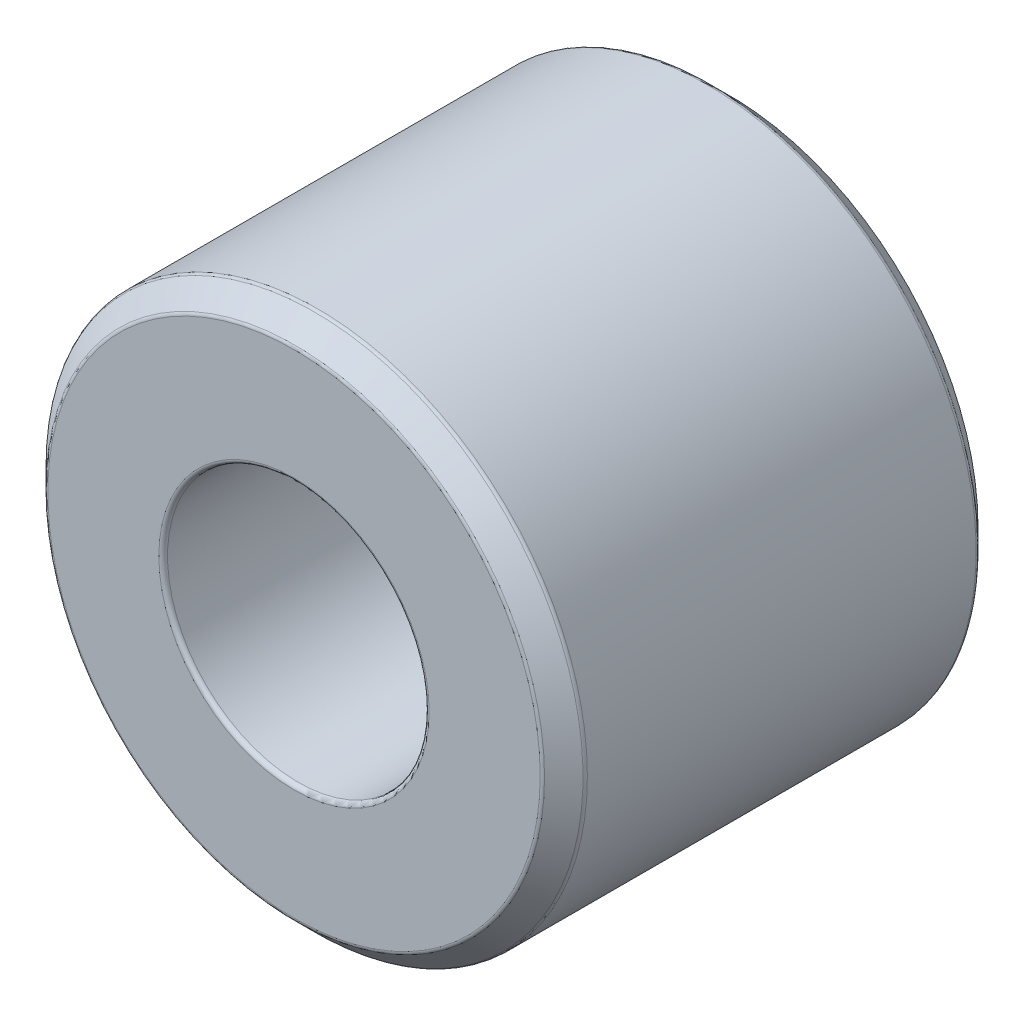
ISO-10303-21;
HEADER;
FILE_DESCRIPTION(('STEP AP214'),'2;1');
FILE_NAME('part.step','',(''),(''),'','','');
FILE_SCHEMA(('AUTOMOTIVE_DESIGN { 1 0 10303 214 1 1 1 1 }'));
ENDSEC;
DATA;
#1=APPLICATION_CONTEXT('core data for automotive mechanical design processes');
#2=APPLICATION_PROTOCOL_DEFINITION('international standard','automotive_design',2000,#1);
#3=PRODUCT_CONTEXT('',#1,'mechanical');
#4=PRODUCT('Part','Part','',(#3));
#5=PRODUCT_RELATED_PRODUCT_CATEGORY('part','',(#4));
#6=PRODUCT_DEFINITION_FORMATION('','',#4);
#7=PRODUCT_DEFINITION_CONTEXT('part definition',#1,'design');
#8=PRODUCT_DEFINITION('design','',#6,#7);
#9=PRODUCT_DEFINITION_SHAPE('','',#8);
#10=(LENGTH_UNIT() NAMED_UNIT(*) SI_UNIT(.MILLI.,.METRE.));
#11=(NAMED_UNIT(*) PLANE_ANGLE_UNIT() SI_UNIT($,.RADIAN.));
#12=(NAMED_UNIT(*) SI_UNIT($,.STERADIAN.) SOLID_ANGLE_UNIT());
#13=UNCERTAINTY_MEASURE_WITH_UNIT(LENGTH_MEASURE(1.E-05),#10,'distance_accuracy_value','');
#14=(GEOMETRIC_REPRESENTATION_CONTEXT(3) GLOBAL_UNCERTAINTY_ASSIGNED_CONTEXT((#13)) GLOBAL_UNIT_ASSIGNED_CONTEXT((#10,
#11,#12)) REPRESENTATION_CONTEXT('',''));
#15=CARTESIAN_POINT('',(0.,0.,0.));
#16=DIRECTION('',(0.,0.,1.));
#17=DIRECTION('',(1.,0.,0.));
#18=AXIS2_PLACEMENT_3D('',#15,#16,#17);
#19=CARTESIAN_POINT('',(0.,0.,10.));
#20=DIRECTION('',(0.,0.,1.));
#21=DIRECTION('',(1.,0.,0.));
#22=AXIS2_PLACEMENT_3D('',#19,#20,#21);
#23=PLANE('',#22);
#24=CARTESIAN_POINT('',(0.,0.,10.));
#25=DIRECTION('',(0.,0.,1.));
#26=DIRECTION('',(1.,0.,0.));
#27=AXIS2_PLACEMENT_3D('',#24,#25,#26);
#28=CIRCLE('',#27,5.64630412326147);
#29=CARTESIAN_POINT('',(5.64630412326147,0.,10.));
#30=VERTEX_POINT('',#29);
#31=EDGE_CURVE('E10',#30,#30,#28,.T.);
#32=ORIENTED_EDGE('',*,*,#31,.T.);
#33=EDGE_LOOP('',(#32));
#34=FACE_BOUND('',#33,.T.);
#35=CARTESIAN_POINT('',(0.,0.,10.));
#36=DIRECTION('',(0.,0.,1.));
#37=DIRECTION('',(1.,0.,0.));
#38=AXIS2_PLACEMENT_3D('',#35,#36,#37);
#39=CIRCLE('',#38,3.1);
#40=CARTESIAN_POINT('',(3.1,0.,10.));
#41=VERTEX_POINT('',#40);
#42=EDGE_CURVE('E74',#41,#41,#39,.F.);
#43=ORIENTED_EDGE('',*,*,#42,.T.);
#44=EDGE_LOOP('',(#43));
#45=FACE_BOUND('',#44,.T.);
#46=ADVANCED_FACE('F39',(#34,#45),#23,.T.);
#47=CARTESIAN_POINT('',(0.,0.,0.));
#48=DIRECTION('',(0.,0.,1.));
#49=DIRECTION('',(1.,0.,0.));
#50=AXIS2_PLACEMENT_3D('',#47,#48,#49);
#51=PLANE('',#50);
#52=CARTESIAN_POINT('',(0.,0.,0.));
#53=DIRECTION('',(0.,0.,1.));
#54=DIRECTION('',(1.,0.,0.));
#55=AXIS2_PLACEMENT_3D('',#52,#53,#54);
#56=CIRCLE('',#55,5.64630412326146);
#57=CARTESIAN_POINT('',(5.64630412326146,0.,0.));
#58=VERTEX_POINT('',#57);
#59=EDGE_CURVE('E53',#58,#58,#56,.F.);
#60=ORIENTED_EDGE('',*,*,#59,.T.);
#61=EDGE_LOOP('',(#60));
#62=FACE_BOUND('',#61,.T.);
#63=CARTESIAN_POINT('',(0.,0.,0.));
#64=DIRECTION('',(0.,0.,1.));
#65=DIRECTION('',(1.,0.,0.));
#66=AXIS2_PLACEMENT_3D('',#63,#64,#65);
#67=CIRCLE('',#66,3.1);
#68=CARTESIAN_POINT('',(3.1,0.,0.));
#69=VERTEX_POINT('',#68);
#70=EDGE_CURVE('E72',#69,#69,#67,.T.);
#71=ORIENTED_EDGE('',*,*,#70,.T.);
#72=EDGE_LOOP('',(#71));
#73=FACE_BOUND('',#72,.T.);
#74=ADVANCED_FACE('F94',(#62,#73),#51,.F.);
#75=CARTESIAN_POINT('',(0.,0.,10.));
#76=DIRECTION('',(0.,0.,-1.));
#77=DIRECTION('',(-1.,0.,0.));
#78=AXIS2_PLACEMENT_3D('',#75,#76,#77);
#79=CYLINDRICAL_SURFACE('',#78,6.18772547949877);
#80=CARTESIAN_POINT('',(0.,0.,0.541421356237309));
#81=DIRECTION('',(0.,0.,-1.));
#82=DIRECTION('',(-1.,0.,0.));
#83=AXIS2_PLACEMENT_3D('',#80,#81,#82);
#84=CIRCLE('',#83,6.18772547949877);
#85=CARTESIAN_POINT('',(-6.18772547949877,0.,0.541421356237309));
#86=VERTEX_POINT('',#85);
#87=EDGE_CURVE('E61',#86,#86,#84,.F.);
#88=ORIENTED_EDGE('',*,*,#87,.T.);
#89=EDGE_LOOP('',(#88));
#90=FACE_BOUND('',#89,.T.);
#91=CARTESIAN_POINT('',(0.,0.,9.45857864376269));
#92=DIRECTION('',(0.,0.,1.));
#93=DIRECTION('',(1.,0.,0.));
#94=AXIS2_PLACEMENT_3D('',#91,#92,#93);
#95=CIRCLE('',#94,6.18772547949877);
#96=CARTESIAN_POINT('',(6.18772547949877,0.,9.45857864376269));
#97=VERTEX_POINT('',#96);
#98=EDGE_CURVE('E70',#97,#97,#95,.F.);
#99=ORIENTED_EDGE('',*,*,#98,.T.);
#100=EDGE_LOOP('',(#99));
#101=FACE_BOUND('',#100,.T.);
#102=ADVANCED_FACE('F96',(#90,#101),#79,.T.);
#103=CARTESIAN_POINT('',(0.,0.,10.));
#104=DIRECTION('',(0.,0.,-1.));
#105=DIRECTION('',(-1.,0.,0.));
#106=AXIS2_PLACEMENT_3D('',#103,#104,#105);
#107=CYLINDRICAL_SURFACE('',#106,3.);
#108=CARTESIAN_POINT('',(0.,0.,9.9));
#109=DIRECTION('',(0.,0.,1.));
#110=DIRECTION('',(1.,0.,0.));
#111=AXIS2_PLACEMENT_3D('',#108,#109,#110);
#112=CIRCLE('',#111,3.);
#113=CARTESIAN_POINT('',(3.,0.,9.9));
#114=VERTEX_POINT('',#113);
#115=EDGE_CURVE('E80',#114,#114,#112,.T.);
#116=ORIENTED_EDGE('',*,*,#115,.T.);
#117=EDGE_LOOP('',(#116));
#118=FACE_BOUND('',#117,.T.);
#119=CARTESIAN_POINT('',(0.,0.,0.0999999999999994));
#120=DIRECTION('',(0.,0.,1.));
#121=DIRECTION('',(1.,0.,0.));
#122=AXIS2_PLACEMENT_3D('',#119,#120,#121);
#123=CIRCLE('',#122,3.);
#124=CARTESIAN_POINT('',(3.,0.,0.0999999999999994));
#125=VERTEX_POINT('',#124);
#126=EDGE_CURVE('E76',#125,#125,#123,.F.);
#127=ORIENTED_EDGE('',*,*,#126,.T.);
#128=EDGE_LOOP('',(#127));
#129=FACE_BOUND('',#128,.T.);
#130=ADVANCED_FACE('F81',(#118,#129),#107,.F.);
#131=CARTESIAN_POINT('',(0.,0.,9.9));
#132=DIRECTION('',(0.,0.,1.));
#133=DIRECTION('',(1.,0.,0.));
#134=AXIS2_PLACEMENT_3D('',#131,#132,#133);
#135=TOROIDAL_SURFACE('',#134,3.1,0.1);
#136=ORIENTED_EDGE('',*,*,#42,.F.);
#137=EDGE_LOOP('',(#136));
#138=FACE_BOUND('',#137,.T.);
#139=ORIENTED_EDGE('',*,*,#115,.F.);
#140=EDGE_LOOP('',(#139));
#141=FACE_BOUND('',#140,.T.);
#142=ADVANCED_FACE('F89',(#138,#141),#135,.T.);
#143=CARTESIAN_POINT('',(0.,0.,0.0999999999999994));
#144=DIRECTION('',(0.,0.,1.));
#145=DIRECTION('',(1.,0.,0.));
#146=AXIS2_PLACEMENT_3D('',#143,#144,#145);
#147=TOROIDAL_SURFACE('',#146,3.1,0.1);
#148=ORIENTED_EDGE('',*,*,#126,.F.);
#149=EDGE_LOOP('',(#148));
#150=FACE_BOUND('',#149,.T.);
#151=ORIENTED_EDGE('',*,*,#70,.F.);
#152=EDGE_LOOP('',(#151));
#153=FACE_BOUND('',#152,.T.);
#154=ADVANCED_FACE('F88',(#150,#153),#147,.T.);
#155=CARTESIAN_POINT('',(0.,0.,0.499999999999999));
#156=DIRECTION('',(0.,0.,1.));
#157=DIRECTION('',(1.,0.,0.));
#158=AXIS2_PLACEMENT_3D('',#155,#156,#157);
#159=CONICAL_SURFACE('',#158,6.18772547949877,0.785398163397451);
#160=CARTESIAN_POINT('',(0.,0.,0.470710678118654));
#161=DIRECTION('',(0.,0.,1.));
#162=DIRECTION('',(1.,0.,0.));
#163=AXIS2_PLACEMENT_3D('',#160,#161,#162);
#164=CIRCLE('',#163,6.15843615761743);
#165=CARTESIAN_POINT('',(6.15843615761743,0.,0.470710678118654));
#166=VERTEX_POINT('',#165);
#167=EDGE_CURVE('E56',#166,#166,#164,.F.);
#168=ORIENTED_EDGE('',*,*,#167,.T.);
#169=EDGE_LOOP('',(#168));
#170=FACE_BOUND('',#169,.T.);
#171=CARTESIAN_POINT('',(0.,0.,0.0292893218813454));
#172=DIRECTION('',(0.,0.,1.));
#173=DIRECTION('',(1.,0.,0.));
#174=AXIS2_PLACEMENT_3D('',#171,#172,#173);
#175=CIRCLE('',#174,5.71701480138012);
#176=CARTESIAN_POINT('',(5.71701480138012,0.,0.0292893218813454));
#177=VERTEX_POINT('',#176);
#178=EDGE_CURVE('E65',#177,#177,#175,.T.);
#179=ORIENTED_EDGE('',*,*,#178,.T.);
#180=EDGE_LOOP('',(#179));
#181=FACE_BOUND('',#180,.T.);
#182=ADVANCED_FACE('F90',(#170,#181),#159,.T.);
#183=CARTESIAN_POINT('',(0.,0.,10.));
#184=DIRECTION('',(0.,0.,-1.));
#185=DIRECTION('',(-1.,0.,0.));
#186=AXIS2_PLACEMENT_3D('',#183,#184,#185);
#187=CONICAL_SURFACE('',#186,5.68772547949878,0.785398163397444);
#188=CARTESIAN_POINT('',(0.,0.,9.52928932188135));
#189=DIRECTION('',(0.,0.,-1.));
#190=DIRECTION('',(-1.,0.,0.));
#191=AXIS2_PLACEMENT_3D('',#188,#189,#190);
#192=CIRCLE('',#191,6.15843615761743);
#193=CARTESIAN_POINT('',(-6.15843615761743,0.,9.52928932188135));
#194=VERTEX_POINT('',#193);
#195=EDGE_CURVE('E46',#194,#194,#192,.F.);
#196=ORIENTED_EDGE('',*,*,#195,.T.);
#197=EDGE_LOOP('',(#196));
#198=FACE_BOUND('',#197,.T.);
#199=CARTESIAN_POINT('',(0.,0.,9.97071067811865));
#200=DIRECTION('',(0.,0.,1.));
#201=DIRECTION('',(1.,0.,0.));
#202=AXIS2_PLACEMENT_3D('',#199,#200,#201);
#203=CIRCLE('',#202,5.71701480138012);
#204=CARTESIAN_POINT('',(5.71701480138012,0.,9.97071067811865));
#205=VERTEX_POINT('',#204);
#206=EDGE_CURVE('E49',#205,#205,#203,.F.);
#207=ORIENTED_EDGE('',*,*,#206,.T.);
#208=EDGE_LOOP('',(#207));
#209=FACE_BOUND('',#208,.T.);
#210=ADVANCED_FACE('F120',(#198,#209),#187,.T.);
#211=CARTESIAN_POINT('',(0.,0.,0.541421356237309));
#212=DIRECTION('',(0.,0.,-1.));
#213=DIRECTION('',(-1.,0.,0.));
#214=AXIS2_PLACEMENT_3D('',#211,#212,#213);
#215=TOROIDAL_SURFACE('',#214,6.08772547949877,0.1);
#216=ORIENTED_EDGE('',*,*,#167,.F.);
#217=EDGE_LOOP('',(#216));
#218=FACE_BOUND('',#217,.T.);
#219=ORIENTED_EDGE('',*,*,#87,.F.);
#220=EDGE_LOOP('',(#219));
#221=FACE_BOUND('',#220,.T.);
#222=ADVANCED_FACE('F125',(#218,#221),#215,.T.);
#223=CARTESIAN_POINT('',(0.,0.,0.1));
#224=DIRECTION('',(0.,0.,1.));
#225=DIRECTION('',(1.,0.,0.));
#226=AXIS2_PLACEMENT_3D('',#223,#224,#225);
#227=TOROIDAL_SURFACE('',#226,5.64630412326146,0.1);
#228=ORIENTED_EDGE('',*,*,#178,.F.);
#229=EDGE_LOOP('',(#228));
#230=FACE_BOUND('',#229,.T.);
#231=ORIENTED_EDGE('',*,*,#59,.F.);
#232=EDGE_LOOP('',(#231));
#233=FACE_BOUND('',#232,.T.);
#234=ADVANCED_FACE('F127',(#230,#233),#227,.T.);
#235=CARTESIAN_POINT('',(0.,0.,9.45857864376269));
#236=DIRECTION('',(0.,0.,1.));
#237=DIRECTION('',(1.,0.,0.));
#238=AXIS2_PLACEMENT_3D('',#235,#236,#237);
#239=TOROIDAL_SURFACE('',#238,6.08772547949877,0.1);
#240=ORIENTED_EDGE('',*,*,#195,.F.);
#241=EDGE_LOOP('',(#240));
#242=FACE_BOUND('',#241,.T.);
#243=ORIENTED_EDGE('',*,*,#98,.F.);
#244=EDGE_LOOP('',(#243));
#245=FACE_BOUND('',#244,.T.);
#246=ADVANCED_FACE('F129',(#242,#245),#239,.T.);
#247=CARTESIAN_POINT('',(0.,0.,9.9));
#248=DIRECTION('',(0.,0.,1.));
#249=DIRECTION('',(1.,0.,0.));
#250=AXIS2_PLACEMENT_3D('',#247,#248,#249);
#251=TOROIDAL_SURFACE('',#250,5.64630412326147,0.1);
#252=ORIENTED_EDGE('',*,*,#206,.F.);
#253=EDGE_LOOP('',(#252));
#254=FACE_BOUND('',#253,.T.);
#255=ORIENTED_EDGE('',*,*,#31,.F.);
#256=EDGE_LOOP('',(#255));
#257=FACE_BOUND('',#256,.T.);
#258=ADVANCED_FACE('F41',(#254,#257),#251,.T.);
#259=CLOSED_SHELL('',(#46,#74,#102,#130,#142,#154,#182,#210,#222,#234,#246,#258));
#260=MANIFOLD_SOLID_BREP('B2',#259);
#261=ADVANCED_BREP_SHAPE_REPRESENTATION('',(#18,#260),#14);
#262=SHAPE_DEFINITION_REPRESENTATION(#9,#261);
ENDSEC;
END-ISO-10303-21;
